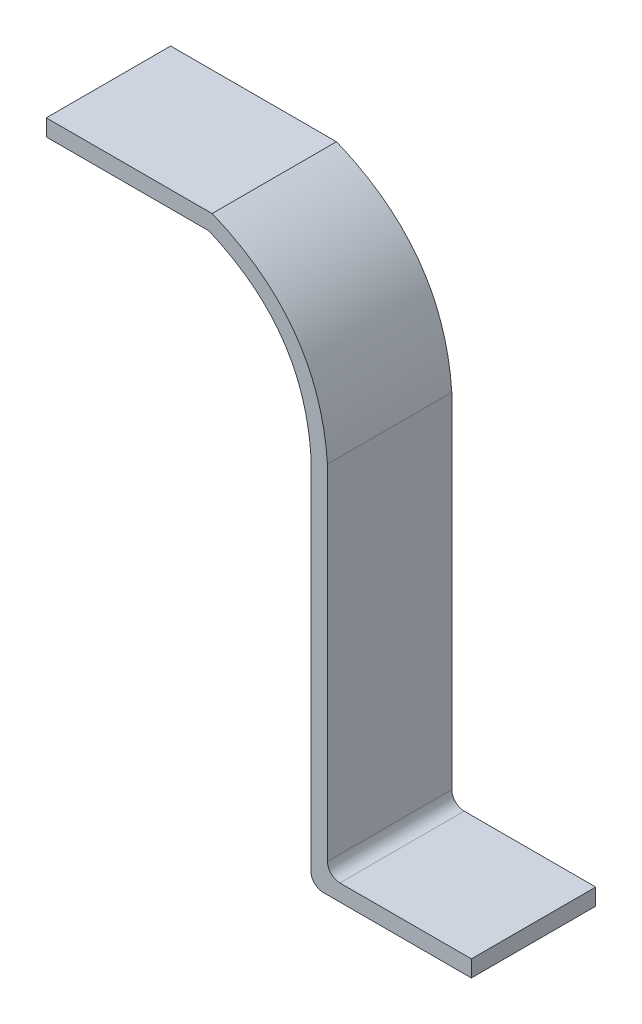
ISO-10303-21;
HEADER;
FILE_DESCRIPTION(('STEP AP214'),'2;1');
FILE_NAME('part.step','',(''),(''),'','','');
FILE_SCHEMA(('AUTOMOTIVE_DESIGN { 1 0 10303 214 1 1 1 1 }'));
ENDSEC;
DATA;
#1=APPLICATION_CONTEXT('core data for automotive mechanical design processes');
#2=APPLICATION_PROTOCOL_DEFINITION('international standard','automotive_design',2000,#1);
#3=PRODUCT_CONTEXT('',#1,'mechanical');
#4=PRODUCT('Part','Part','',(#3));
#5=PRODUCT_RELATED_PRODUCT_CATEGORY('part','',(#4));
#6=PRODUCT_DEFINITION_FORMATION('','',#4);
#7=PRODUCT_DEFINITION_CONTEXT('part definition',#1,'design');
#8=PRODUCT_DEFINITION('design','',#6,#7);
#9=PRODUCT_DEFINITION_SHAPE('','',#8);
#10=(LENGTH_UNIT() NAMED_UNIT(*) SI_UNIT(.MILLI.,.METRE.));
#11=(NAMED_UNIT(*) PLANE_ANGLE_UNIT() SI_UNIT($,.RADIAN.));
#12=(NAMED_UNIT(*) SI_UNIT($,.STERADIAN.) SOLID_ANGLE_UNIT());
#13=UNCERTAINTY_MEASURE_WITH_UNIT(LENGTH_MEASURE(1.E-05),#10,'distance_accuracy_value','');
#14=(GEOMETRIC_REPRESENTATION_CONTEXT(3) GLOBAL_UNCERTAINTY_ASSIGNED_CONTEXT((#13)) GLOBAL_UNIT_ASSIGNED_CONTEXT((#10,
#11,#12)) REPRESENTATION_CONTEXT('',''));
#15=CARTESIAN_POINT('',(0.,0.,0.));
#16=DIRECTION('',(0.,0.,1.));
#17=DIRECTION('',(1.,0.,0.));
#18=AXIS2_PLACEMENT_3D('',#15,#16,#17);
#19=CARTESIAN_POINT('',(-40.,38.5569469858598,30.));
#20=DIRECTION('',(1.,0.,0.));
#21=DIRECTION('',(0.,0.,-1.));
#22=AXIS2_PLACEMENT_3D('',#19,#20,#21);
#23=PLANE('',#22);
#24=DIRECTION('',(0.,-1.,0.));
#25=VECTOR('',#24,1.);
#26=CARTESIAN_POINT('',(-40.,38.5569469858598,0.));
#27=LINE('',#26,#25);
#28=CARTESIAN_POINT('',(-40.,38.5569469858598,0.));
#29=VERTEX_POINT('',#28);
#30=CARTESIAN_POINT('',(-40.,34.5569469858598,0.));
#31=VERTEX_POINT('',#30);
#32=EDGE_CURVE('E258',#29,#31,#27,.T.);
#33=ORIENTED_EDGE('',*,*,#32,.T.);
#34=DIRECTION('',(0.,0.,-1.));
#35=VECTOR('',#34,1.);
#36=CARTESIAN_POINT('',(-40.,34.5569469858598,30.));
#37=LINE('',#36,#35);
#38=CARTESIAN_POINT('',(-40.,34.5569469858598,30.));
#39=VERTEX_POINT('',#38);
#40=EDGE_CURVE('E11',#39,#31,#37,.T.);
#41=ORIENTED_EDGE('',*,*,#40,.F.);
#42=DIRECTION('',(0.,-1.,0.));
#43=VECTOR('',#42,1.);
#44=CARTESIAN_POINT('',(-40.,38.5569469858598,30.));
#45=LINE('',#44,#43);
#46=CARTESIAN_POINT('',(-40.,38.5569469858598,30.));
#47=VERTEX_POINT('',#46);
#48=EDGE_CURVE('E282',#47,#39,#45,.T.);
#49=ORIENTED_EDGE('',*,*,#48,.F.);
#50=DIRECTION('',(0.,0.,-1.));
#51=VECTOR('',#50,1.);
#52=CARTESIAN_POINT('',(-40.,38.5569469858598,30.));
#53=LINE('',#52,#51);
#54=EDGE_CURVE('E149',#47,#29,#53,.T.);
#55=ORIENTED_EDGE('',*,*,#54,.T.);
#56=EDGE_LOOP('',(#33,#41,#49,#55));
#57=FACE_BOUND('',#56,.T.);
#58=ADVANCED_FACE('F33',(#57),#23,.F.);
#59=CARTESIAN_POINT('',(-40.,34.5569469858598,30.));
#60=DIRECTION('',(0.,1.,0.));
#61=DIRECTION('',(0.,0.,1.));
#62=AXIS2_PLACEMENT_3D('',#59,#60,#61);
#63=PLANE('',#62);
#64=DIRECTION('',(1.,0.,0.));
#65=VECTOR('',#64,1.);
#66=CARTESIAN_POINT('',(-40.,34.5569469858598,0.));
#67=LINE('',#66,#65);
#68=CARTESIAN_POINT('',(-0.796307780605879,34.5569469858598,0.));
#69=VERTEX_POINT('',#68);
#70=EDGE_CURVE('E252',#31,#69,#67,.T.);
#71=ORIENTED_EDGE('',*,*,#70,.T.);
#72=DIRECTION('',(0.,0.,-1.));
#73=VECTOR('',#72,1.);
#74=CARTESIAN_POINT('',(-0.796307780605879,34.5569469858598,30.));
#75=LINE('',#74,#73);
#76=CARTESIAN_POINT('',(-0.796307780605879,34.5569469858598,30.));
#77=VERTEX_POINT('',#76);
#78=EDGE_CURVE('E41',#77,#69,#75,.T.);
#79=ORIENTED_EDGE('',*,*,#78,.F.);
#80=DIRECTION('',(1.,0.,0.));
#81=VECTOR('',#80,1.);
#82=CARTESIAN_POINT('',(-40.,34.5569469858598,30.));
#83=LINE('',#82,#81);
#84=EDGE_CURVE('E104',#39,#77,#83,.T.);
#85=ORIENTED_EDGE('',*,*,#84,.F.);
#86=ORIENTED_EDGE('',*,*,#40,.T.);
#87=EDGE_LOOP('',(#71,#79,#85,#86));
#88=FACE_BOUND('',#87,.T.);
#89=ADVANCED_FACE('F194',(#88),#63,.F.);
#90=CARTESIAN_POINT('',(-0.796307780605879,34.5569469858598,30.));
#91=CARTESIAN_POINT('',(-0.313071461540387,34.3527185194732,30.));
#92=CARTESIAN_POINT('',(0.654712669960819,33.9275723253603,30.));
#93=CARTESIAN_POINT('',(2.50937158066745,33.0474045894553,30.));
#94=CARTESIAN_POINT('',(4.71640779683927,31.8749922294776,30.));
#95=CARTESIAN_POINT('',(7.17688030545711,30.3596393698524,30.));
#96=CARTESIAN_POINT('',(10.2158026071734,28.1942093114183,30.));
#97=CARTESIAN_POINT('',(13.5690398724176,25.2181129104953,30.));
#98=CARTESIAN_POINT('',(16.9172313789708,21.2061148409585,30.));
#99=CARTESIAN_POINT('',(19.6215815962546,16.7244589971828,30.));
#100=CARTESIAN_POINT('',(21.3516207260716,12.565197334906,30.));
#101=CARTESIAN_POINT('',(22.4194795213211,8.96441287906309,30.));
#102=CARTESIAN_POINT('',(23.0602469312357,6.12469474166883,30.));
#103=CARTESIAN_POINT('',(23.4591490764942,3.63705545068434,30.));
#104=CARTESIAN_POINT('',(23.6954690184502,1.58024166150593,30.));
#105=CARTESIAN_POINT('',(23.7866575430655,0.517816430964386,30.));
#106=CARTESIAN_POINT('',(23.8246009176308,-0.0100134398550681,30.));
#107=B_SPLINE_CURVE_WITH_KNOTS('',3,(#90,#91,#92,#93,#94,#95,#96,#97,#98,#99,#100,#101,#102,
#103,#104,#105,#106),.UNSPECIFIED.,.F.,.F.,(4,1,1,1,1,1,1,1,1,1,1,1,1,1,4),(0.0147977182600105,
0.0455036557641376,0.0762095932682647,0.137621468276519,0.199033343284773,0.260445218293027,
0.383268968309536,0.506092718326044,0.628916468342553,0.751740218359061,0.813152093367315,
0.874563968375569,0.935975843383823,0.966681780887951,0.997387718392078),.UNSPECIFIED.);
#108=DIRECTION('',(0.,0.,-1.));
#109=VECTOR('',#108,1.);
#110=SURFACE_OF_LINEAR_EXTRUSION('',#107,#109);
#111=CARTESIAN_POINT('',(-0.796307780605879,34.5569469858598,0.));
#112=CARTESIAN_POINT('',(-0.313071461540387,34.3527185194732,0.));
#113=CARTESIAN_POINT('',(0.654712669960819,33.9275723253603,0.));
#114=CARTESIAN_POINT('',(2.50937158066745,33.0474045894553,0.));
#115=CARTESIAN_POINT('',(4.71640779683927,31.8749922294776,0.));
#116=CARTESIAN_POINT('',(7.17688030545711,30.3596393698524,0.));
#117=CARTESIAN_POINT('',(10.2158026071734,28.1942093114183,0.));
#118=CARTESIAN_POINT('',(13.5690398724176,25.2181129104953,0.));
#119=CARTESIAN_POINT('',(16.9172313789708,21.2061148409585,0.));
#120=CARTESIAN_POINT('',(19.6215815962546,16.7244589971828,0.));
#121=CARTESIAN_POINT('',(21.3516207260716,12.565197334906,0.));
#122=CARTESIAN_POINT('',(22.4194795213211,8.96441287906309,0.));
#123=CARTESIAN_POINT('',(23.0602469312357,6.12469474166883,0.));
#124=CARTESIAN_POINT('',(23.4591490764942,3.63705545068434,0.));
#125=CARTESIAN_POINT('',(23.6954690184502,1.58024166150593,0.));
#126=CARTESIAN_POINT('',(23.7866575430655,0.517816430964386,0.));
#127=CARTESIAN_POINT('',(23.8246009176308,-0.0100134398550681,0.));
#128=B_SPLINE_CURVE_WITH_KNOTS('',3,(#111,#112,#113,#114,#115,#116,#117,#118,#119,#120,#121,
#122,#123,#124,#125,#126,#127),.UNSPECIFIED.,.F.,.F.,(4,1,1,1,1,1,1,1,1,1,1,1,1,1,4),
(0.0147977182600105,0.0455036557641376,0.0762095932682647,0.137621468276519,0.199033343284773,
0.260445218293027,0.383268968309536,0.506092718326044,0.628916468342553,0.751740218359061,
0.813152093367315,0.874563968375569,0.935975843383823,0.966681780887951,0.997387718392078),.UNSPECIFIED.);
#129=CARTESIAN_POINT('',(23.8246009176308,-0.0100134398550681,0.));
#130=VERTEX_POINT('',#129);
#131=EDGE_CURVE('E247',#69,#130,#128,.T.);
#132=ORIENTED_EDGE('',*,*,#131,.T.);
#133=DIRECTION('',(0.,0.,-1.));
#134=VECTOR('',#133,1.);
#135=CARTESIAN_POINT('',(23.8246009176308,-0.0100134398550681,30.));
#136=LINE('',#135,#134);
#137=CARTESIAN_POINT('',(23.8246009176308,-0.0100134398550681,30.));
#138=VERTEX_POINT('',#137);
#139=EDGE_CURVE('E241',#138,#130,#136,.T.);
#140=ORIENTED_EDGE('',*,*,#139,.F.);
#141=EDGE_CURVE('E196',#77,#138,#107,.T.);
#142=ORIENTED_EDGE('',*,*,#141,.F.);
#143=ORIENTED_EDGE('',*,*,#78,.T.);
#144=EDGE_LOOP('',(#132,#140,#142,#143));
#145=FACE_BOUND('',#144,.T.);
#146=ADVANCED_FACE('F190',(#145),#110,.F.);
#147=CARTESIAN_POINT('',(23.8246009176308,-0.0100134398550681,30.));
#148=DIRECTION('',(1.,0.,0.));
#149=DIRECTION('',(0.,1.,0.));
#150=AXIS2_PLACEMENT_3D('',#147,#148,#149);
#151=PLANE('',#150);
#152=DIRECTION('',(0.,-1.,0.));
#153=VECTOR('',#152,1.);
#154=CARTESIAN_POINT('',(23.8246009176308,-0.0100134398550681,0.));
#155=LINE('',#154,#153);
#156=CARTESIAN_POINT('',(23.8246009176308,-86.8688191018762,0.));
#157=VERTEX_POINT('',#156);
#158=EDGE_CURVE('E254',#130,#157,#155,.T.);
#159=ORIENTED_EDGE('',*,*,#158,.T.);
#160=DIRECTION('',(0.,0.,-1.));
#161=VECTOR('',#160,1.);
#162=CARTESIAN_POINT('',(23.8246009176308,-86.8688191018762,30.));
#163=LINE('',#162,#161);
#164=CARTESIAN_POINT('',(23.8246009176308,-86.8688191018762,30.));
#165=VERTEX_POINT('',#164);
#166=EDGE_CURVE('E238',#165,#157,#163,.T.);
#167=ORIENTED_EDGE('',*,*,#166,.F.);
#168=DIRECTION('',(0.,-1.,0.));
#169=VECTOR('',#168,1.);
#170=CARTESIAN_POINT('',(23.8246009176308,-0.0100134398550681,30.));
#171=LINE('',#170,#169);
#172=EDGE_CURVE('E202',#138,#165,#171,.T.);
#173=ORIENTED_EDGE('',*,*,#172,.F.);
#174=ORIENTED_EDGE('',*,*,#139,.T.);
#175=EDGE_LOOP('',(#159,#167,#173,#174));
#176=FACE_BOUND('',#175,.T.);
#177=ADVANCED_FACE('F186',(#176),#151,.F.);
#178=CARTESIAN_POINT('',(26.8246009176308,-86.8688191018762,30.));
#179=DIRECTION('',(0.,0.,-1.));
#180=DIRECTION('',(-1.,0.,0.));
#181=AXIS2_PLACEMENT_3D('',#178,#179,#180);
#182=CYLINDRICAL_SURFACE('',#181,3.);
#183=CARTESIAN_POINT('',(26.8246009176308,-86.8688191018762,0.));
#184=DIRECTION('',(0.,0.,1.));
#185=DIRECTION('',(1.,0.,0.));
#186=AXIS2_PLACEMENT_3D('',#183,#184,#185);
#187=CIRCLE('',#186,3.);
#188=CARTESIAN_POINT('',(26.8246009176308,-89.8688191018762,0.));
#189=VERTEX_POINT('',#188);
#190=EDGE_CURVE('E256',#157,#189,#187,.T.);
#191=ORIENTED_EDGE('',*,*,#190,.T.);
#192=DIRECTION('',(0.,0.,-1.));
#193=VECTOR('',#192,1.);
#194=CARTESIAN_POINT('',(26.8246009176308,-89.8688191018762,30.));
#195=LINE('',#194,#193);
#196=CARTESIAN_POINT('',(26.8246009176308,-89.8688191018762,30.));
#197=VERTEX_POINT('',#196);
#198=EDGE_CURVE('E235',#197,#189,#195,.T.);
#199=ORIENTED_EDGE('',*,*,#198,.F.);
#200=CARTESIAN_POINT('',(26.8246009176308,-86.8688191018762,30.));
#201=DIRECTION('',(0.,0.,1.));
#202=DIRECTION('',(1.,0.,0.));
#203=AXIS2_PLACEMENT_3D('',#200,#201,#202);
#204=CIRCLE('',#203,3.);
#205=EDGE_CURVE('E208',#165,#197,#204,.T.);
#206=ORIENTED_EDGE('',*,*,#205,.F.);
#207=ORIENTED_EDGE('',*,*,#166,.T.);
#208=EDGE_LOOP('',(#191,#199,#206,#207));
#209=FACE_BOUND('',#208,.T.);
#210=ADVANCED_FACE('F182',(#209),#182,.T.);
#211=CARTESIAN_POINT('',(62.5413066180727,-89.8688191018762,30.));
#212=DIRECTION('',(0.,1.,0.));
#213=DIRECTION('',(0.,0.,1.));
#214=AXIS2_PLACEMENT_3D('',#211,#212,#213);
#215=PLANE('',#214);
#216=DIRECTION('',(1.,0.,0.));
#217=VECTOR('',#216,1.);
#218=CARTESIAN_POINT('',(62.5413066180727,-89.8688191018762,0.));
#219=LINE('',#218,#217);
#220=CARTESIAN_POINT('',(62.5413066180727,-89.8688191018762,0.));
#221=VERTEX_POINT('',#220);
#222=EDGE_CURVE('E268',#189,#221,#219,.T.);
#223=ORIENTED_EDGE('',*,*,#222,.T.);
#224=DIRECTION('',(0.,0.,-1.));
#225=VECTOR('',#224,1.);
#226=CARTESIAN_POINT('',(62.5413066180727,-89.8688191018762,30.));
#227=LINE('',#226,#225);
#228=CARTESIAN_POINT('',(62.5413066180727,-89.8688191018762,30.));
#229=VERTEX_POINT('',#228);
#230=EDGE_CURVE('E232',#229,#221,#227,.T.);
#231=ORIENTED_EDGE('',*,*,#230,.F.);
#232=DIRECTION('',(1.,0.,0.));
#233=VECTOR('',#232,1.);
#234=CARTESIAN_POINT('',(27.8246009176308,-89.8688191018762,30.));
#235=LINE('',#234,#233);
#236=EDGE_CURVE('E210',#197,#229,#235,.T.);
#237=ORIENTED_EDGE('',*,*,#236,.F.);
#238=ORIENTED_EDGE('',*,*,#198,.T.);
#239=EDGE_LOOP('',(#223,#231,#237,#238));
#240=FACE_BOUND('',#239,.T.);
#241=ADVANCED_FACE('F178',(#240),#215,.F.);
#242=CARTESIAN_POINT('',(62.5413066180727,-85.8688191018762,30.));
#243=DIRECTION('',(-1.,0.,0.));
#244=DIRECTION('',(0.,0.,1.));
#245=AXIS2_PLACEMENT_3D('',#242,#243,#244);
#246=PLANE('',#245);
#247=DIRECTION('',(0.,1.,0.));
#248=VECTOR('',#247,1.);
#249=CARTESIAN_POINT('',(62.5413066180727,-85.8688191018762,0.));
#250=LINE('',#249,#248);
#251=CARTESIAN_POINT('',(62.5413066180727,-85.8688191018762,0.));
#252=VERTEX_POINT('',#251);
#253=EDGE_CURVE('E270',#221,#252,#250,.T.);
#254=ORIENTED_EDGE('',*,*,#253,.T.);
#255=DIRECTION('',(0.,0.,-1.));
#256=VECTOR('',#255,1.);
#257=CARTESIAN_POINT('',(62.5413066180727,-85.8688191018762,30.));
#258=LINE('',#257,#256);
#259=CARTESIAN_POINT('',(62.5413066180727,-85.8688191018762,30.));
#260=VERTEX_POINT('',#259);
#261=EDGE_CURVE('E225',#260,#252,#258,.T.);
#262=ORIENTED_EDGE('',*,*,#261,.F.);
#263=DIRECTION('',(0.,1.,0.));
#264=VECTOR('',#263,1.);
#265=CARTESIAN_POINT('',(62.5413066180727,-85.8688191018762,30.));
#266=LINE('',#265,#264);
#267=EDGE_CURVE('E212',#229,#260,#266,.T.);
#268=ORIENTED_EDGE('',*,*,#267,.F.);
#269=ORIENTED_EDGE('',*,*,#230,.T.);
#270=EDGE_LOOP('',(#254,#262,#268,#269));
#271=FACE_BOUND('',#270,.T.);
#272=ADVANCED_FACE('F174',(#271),#246,.F.);
#273=CARTESIAN_POINT('',(30.8246009176308,-85.8688191018762,30.));
#274=DIRECTION('',(0.,-1.,0.));
#275=DIRECTION('',(0.,0.,-1.));
#276=AXIS2_PLACEMENT_3D('',#273,#274,#275);
#277=PLANE('',#276);
#278=DIRECTION('',(-1.,0.,0.));
#279=VECTOR('',#278,1.);
#280=CARTESIAN_POINT('',(30.8246009176308,-85.8688191018762,0.));
#281=LINE('',#280,#279);
#282=CARTESIAN_POINT('',(30.8246009176308,-85.8688191018762,0.));
#283=VERTEX_POINT('',#282);
#284=EDGE_CURVE('E223',#252,#283,#281,.T.);
#285=ORIENTED_EDGE('',*,*,#284,.T.);
#286=DIRECTION('',(0.,0.,-1.));
#287=VECTOR('',#286,1.);
#288=CARTESIAN_POINT('',(30.8246009176308,-85.8688191018762,30.));
#289=LINE('',#288,#287);
#290=CARTESIAN_POINT('',(30.8246009176308,-85.8688191018762,30.));
#291=VERTEX_POINT('',#290);
#292=EDGE_CURVE('E221',#291,#283,#289,.T.);
#293=ORIENTED_EDGE('',*,*,#292,.F.);
#294=DIRECTION('',(-1.,0.,0.));
#295=VECTOR('',#294,1.);
#296=CARTESIAN_POINT('',(30.8246009176308,-85.8688191018762,30.));
#297=LINE('',#296,#295);
#298=EDGE_CURVE('E214',#260,#291,#297,.T.);
#299=ORIENTED_EDGE('',*,*,#298,.F.);
#300=ORIENTED_EDGE('',*,*,#261,.T.);
#301=EDGE_LOOP('',(#285,#293,#299,#300));
#302=FACE_BOUND('',#301,.T.);
#303=ADVANCED_FACE('F170',(#302),#277,.F.);
#304=CARTESIAN_POINT('',(30.8246009176308,-82.8688191018762,30.));
#305=DIRECTION('',(0.,0.,-1.));
#306=DIRECTION('',(-1.,0.,0.));
#307=AXIS2_PLACEMENT_3D('',#304,#305,#306);
#308=CYLINDRICAL_SURFACE('',#307,3.);
#309=CARTESIAN_POINT('',(30.8246009176308,-82.8688191018762,0.));
#310=DIRECTION('',(0.,0.,-1.));
#311=DIRECTION('',(1.,0.,0.));
#312=AXIS2_PLACEMENT_3D('',#309,#310,#311);
#313=CIRCLE('',#312,3.);
#314=CARTESIAN_POINT('',(27.8246009176308,-82.8688191018762,0.));
#315=VERTEX_POINT('',#314);
#316=EDGE_CURVE('E227',#283,#315,#313,.T.);
#317=ORIENTED_EDGE('',*,*,#316,.T.);
#318=DIRECTION('',(0.,0.,-1.));
#319=VECTOR('',#318,1.);
#320=CARTESIAN_POINT('',(27.8246009176308,-82.8688191018762,30.));
#321=LINE('',#320,#319);
#322=CARTESIAN_POINT('',(27.8246009176308,-82.8688191018762,30.));
#323=VERTEX_POINT('',#322);
#324=EDGE_CURVE('E144',#323,#315,#321,.T.);
#325=ORIENTED_EDGE('',*,*,#324,.F.);
#326=CARTESIAN_POINT('',(30.8246009176308,-82.8688191018762,30.));
#327=DIRECTION('',(0.,0.,-1.));
#328=DIRECTION('',(1.,0.,0.));
#329=AXIS2_PLACEMENT_3D('',#326,#327,#328);
#330=CIRCLE('',#329,3.);
#331=EDGE_CURVE('E135',#291,#323,#330,.T.);
#332=ORIENTED_EDGE('',*,*,#331,.F.);
#333=ORIENTED_EDGE('',*,*,#292,.T.);
#334=EDGE_LOOP('',(#317,#325,#332,#333));
#335=FACE_BOUND('',#334,.T.);
#336=ADVANCED_FACE('F167',(#335),#308,.F.);
#337=CARTESIAN_POINT('',(27.8246009176308,0.131180898123765,30.));
#338=DIRECTION('',(-1.,0.,0.));
#339=DIRECTION('',(0.,-1.,0.));
#340=AXIS2_PLACEMENT_3D('',#337,#338,#339);
#341=PLANE('',#340);
#342=DIRECTION('',(0.,1.,0.));
#343=VECTOR('',#342,1.);
#344=CARTESIAN_POINT('',(27.8246009176308,0.131180898123765,0.));
#345=LINE('',#344,#343);
#346=CARTESIAN_POINT('',(27.8246009176308,0.131180898123765,0.));
#347=VERTEX_POINT('',#346);
#348=EDGE_CURVE('E143',#315,#347,#345,.T.);
#349=ORIENTED_EDGE('',*,*,#348,.T.);
#350=DIRECTION('',(0.,0.,-1.));
#351=VECTOR('',#350,1.);
#352=CARTESIAN_POINT('',(27.8246009176308,0.131180898123765,30.));
#353=LINE('',#352,#351);
#354=CARTESIAN_POINT('',(27.8246009176308,0.131180898123765,30.));
#355=VERTEX_POINT('',#354);
#356=EDGE_CURVE('E140',#355,#347,#353,.T.);
#357=ORIENTED_EDGE('',*,*,#356,.F.);
#358=DIRECTION('',(0.,1.,0.));
#359=VECTOR('',#358,1.);
#360=CARTESIAN_POINT('',(27.8246009176308,0.131180898123765,30.));
#361=LINE('',#360,#359);
#362=EDGE_CURVE('E129',#323,#355,#361,.T.);
#363=ORIENTED_EDGE('',*,*,#362,.F.);
#364=ORIENTED_EDGE('',*,*,#324,.T.);
#365=EDGE_LOOP('',(#349,#357,#363,#364));
#366=FACE_BOUND('',#365,.T.);
#367=ADVANCED_FACE('F141',(#366),#341,.F.);
#368=CARTESIAN_POINT('',(27.8246009176308,0.131180898123765,30.));
#369=CARTESIAN_POINT('',(25.885340012037,28.0237524922799,30.));
#370=CARTESIAN_POINT('',(0.,38.5569469858598,30.));
#371=B_SPLINE_CURVE_WITH_KNOTS('',2,(#368,#369,#370),.UNSPECIFIED.,.F.,.F.,(3,3),(0.,1.),.UNSPECIFIED.);
#372=DIRECTION('',(0.,0.,-1.));
#373=VECTOR('',#372,1.);
#374=SURFACE_OF_LINEAR_EXTRUSION('',#371,#373);
#375=CARTESIAN_POINT('',(27.8246009176308,0.131180898123765,0.));
#376=CARTESIAN_POINT('',(25.885340012037,28.0237524922799,0.));
#377=CARTESIAN_POINT('',(0.,38.5569469858598,0.));
#378=B_SPLINE_CURVE_WITH_KNOTS('',2,(#375,#376,#377),.UNSPECIFIED.,.F.,.F.,(3,3),(0.,1.),.UNSPECIFIED.);
#379=CARTESIAN_POINT('',(0.,38.5569469858598,0.));
#380=VERTEX_POINT('',#379);
#381=EDGE_CURVE('E90',#347,#380,#378,.T.);
#382=ORIENTED_EDGE('',*,*,#381,.T.);
#383=DIRECTION('',(0.,0.,-1.));
#384=VECTOR('',#383,1.);
#385=CARTESIAN_POINT('',(0.,38.5569469858598,30.));
#386=LINE('',#385,#384);
#387=CARTESIAN_POINT('',(0.,38.5569469858598,30.));
#388=VERTEX_POINT('',#387);
#389=EDGE_CURVE('E145',#388,#380,#386,.T.);
#390=ORIENTED_EDGE('',*,*,#389,.F.);
#391=EDGE_CURVE('E133',#355,#388,#371,.T.);
#392=ORIENTED_EDGE('',*,*,#391,.F.);
#393=ORIENTED_EDGE('',*,*,#356,.T.);
#394=EDGE_LOOP('',(#382,#390,#392,#393));
#395=FACE_BOUND('',#394,.T.);
#396=ADVANCED_FACE('F147',(#395),#374,.F.);
#397=CARTESIAN_POINT('',(-40.,38.5569469858598,30.));
#398=DIRECTION('',(0.,-1.,0.));
#399=DIRECTION('',(0.,0.,-1.));
#400=AXIS2_PLACEMENT_3D('',#397,#398,#399);
#401=PLANE('',#400);
#402=DIRECTION('',(-1.,0.,0.));
#403=VECTOR('',#402,1.);
#404=CARTESIAN_POINT('',(-40.,38.5569469858598,0.));
#405=LINE('',#404,#403);
#406=EDGE_CURVE('E96',#380,#29,#405,.T.);
#407=ORIENTED_EDGE('',*,*,#406,.T.);
#408=ORIENTED_EDGE('',*,*,#54,.F.);
#409=DIRECTION('',(-1.,0.,0.));
#410=VECTOR('',#409,1.);
#411=CARTESIAN_POINT('',(-40.,38.5569469858598,30.));
#412=LINE('',#411,#410);
#413=EDGE_CURVE('E49',#388,#47,#412,.T.);
#414=ORIENTED_EDGE('',*,*,#413,.F.);
#415=ORIENTED_EDGE('',*,*,#389,.T.);
#416=EDGE_LOOP('',(#407,#408,#414,#415));
#417=FACE_BOUND('',#416,.T.);
#418=ADVANCED_FACE('F163',(#417),#401,.F.);
#419=CARTESIAN_POINT('',(16.8099244974259,21.127838545252,30.));
#420=DIRECTION('',(0.,0.,1.));
#421=DIRECTION('',(1.,0.,0.));
#422=AXIS2_PLACEMENT_3D('',#419,#420,#421);
#423=PLANE('',#422);
#424=ORIENTED_EDGE('',*,*,#48,.T.);
#425=ORIENTED_EDGE('',*,*,#84,.T.);
#426=ORIENTED_EDGE('',*,*,#141,.T.);
#427=ORIENTED_EDGE('',*,*,#172,.T.);
#428=ORIENTED_EDGE('',*,*,#205,.T.);
#429=ORIENTED_EDGE('',*,*,#236,.T.);
#430=ORIENTED_EDGE('',*,*,#267,.T.);
#431=ORIENTED_EDGE('',*,*,#298,.T.);
#432=ORIENTED_EDGE('',*,*,#331,.T.);
#433=ORIENTED_EDGE('',*,*,#362,.T.);
#434=ORIENTED_EDGE('',*,*,#391,.T.);
#435=ORIENTED_EDGE('',*,*,#413,.T.);
#436=EDGE_LOOP('',(#424,#425,#426,#427,#428,#429,#430,#431,#432,#433,#434,#435));
#437=FACE_BOUND('',#436,.T.);
#438=ADVANCED_FACE('F131',(#437),#423,.T.);
#439=CARTESIAN_POINT('',(16.8099244974259,21.127838545252,0.));
#440=DIRECTION('',(0.,0.,1.));
#441=DIRECTION('',(1.,0.,0.));
#442=AXIS2_PLACEMENT_3D('',#439,#440,#441);
#443=PLANE('',#442);
#444=ORIENTED_EDGE('',*,*,#32,.F.);
#445=ORIENTED_EDGE('',*,*,#406,.F.);
#446=ORIENTED_EDGE('',*,*,#381,.F.);
#447=ORIENTED_EDGE('',*,*,#348,.F.);
#448=ORIENTED_EDGE('',*,*,#316,.F.);
#449=ORIENTED_EDGE('',*,*,#284,.F.);
#450=ORIENTED_EDGE('',*,*,#253,.F.);
#451=ORIENTED_EDGE('',*,*,#222,.F.);
#452=ORIENTED_EDGE('',*,*,#190,.F.);
#453=ORIENTED_EDGE('',*,*,#158,.F.);
#454=ORIENTED_EDGE('',*,*,#131,.F.);
#455=ORIENTED_EDGE('',*,*,#70,.F.);
#456=EDGE_LOOP('',(#444,#445,#446,#447,#448,#449,#450,#451,#452,#453,#454,#455));
#457=FACE_BOUND('',#456,.T.);
#458=ADVANCED_FACE('F251',(#457),#443,.F.);
#459=CLOSED_SHELL('',(#58,#89,#146,#177,#210,#241,#272,#303,#336,#367,#396,#418,#438,#458));
#460=MANIFOLD_SOLID_BREP('B2',#459);
#461=ADVANCED_BREP_SHAPE_REPRESENTATION('',(#18,#460),#14);
#462=SHAPE_DEFINITION_REPRESENTATION(#9,#461);
ENDSEC;
END-ISO-10303-21;
